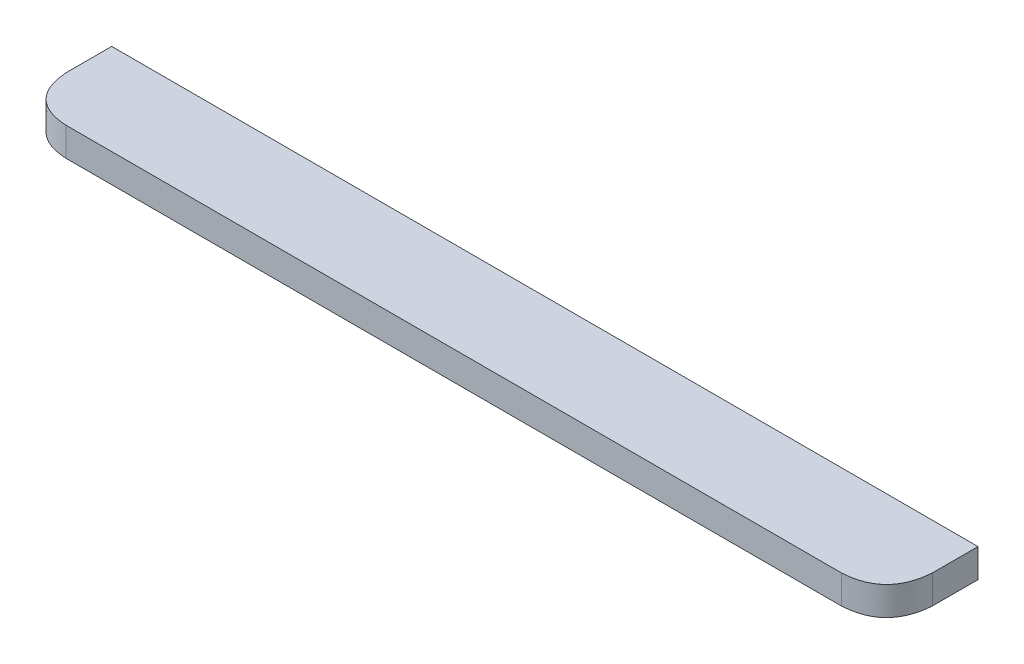
ISO-10303-21;
HEADER;
FILE_DESCRIPTION(('STEP AP214'),'2;1');
FILE_NAME('part.step','',(''),(''),'','','');
FILE_SCHEMA(('AUTOMOTIVE_DESIGN { 1 0 10303 214 1 1 1 1 }'));
ENDSEC;
DATA;
#1=APPLICATION_CONTEXT('core data for automotive mechanical design processes');
#2=APPLICATION_PROTOCOL_DEFINITION('international standard','automotive_design',2000,#1);
#3=PRODUCT_CONTEXT('',#1,'mechanical');
#4=PRODUCT('Part','Part','',(#3));
#5=PRODUCT_RELATED_PRODUCT_CATEGORY('part','',(#4));
#6=PRODUCT_DEFINITION_FORMATION('','',#4);
#7=PRODUCT_DEFINITION_CONTEXT('part definition',#1,'design');
#8=PRODUCT_DEFINITION('design','',#6,#7);
#9=PRODUCT_DEFINITION_SHAPE('','',#8);
#10=(LENGTH_UNIT() NAMED_UNIT(*) SI_UNIT(.MILLI.,.METRE.));
#11=(NAMED_UNIT(*) PLANE_ANGLE_UNIT() SI_UNIT($,.RADIAN.));
#12=(NAMED_UNIT(*) SI_UNIT($,.STERADIAN.) SOLID_ANGLE_UNIT());
#13=UNCERTAINTY_MEASURE_WITH_UNIT(LENGTH_MEASURE(1.E-05),#10,'distance_accuracy_value','');
#14=(GEOMETRIC_REPRESENTATION_CONTEXT(3) GLOBAL_UNCERTAINTY_ASSIGNED_CONTEXT((#13)) GLOBAL_UNIT_ASSIGNED_CONTEXT((#10,
#11,#12)) REPRESENTATION_CONTEXT('',''));
#15=CARTESIAN_POINT('',(0.,0.,0.));
#16=DIRECTION('',(0.,0.,1.));
#17=DIRECTION('',(1.,0.,0.));
#18=AXIS2_PLACEMENT_3D('',#15,#16,#17);
#19=CARTESIAN_POINT('',(120.777,8.,-0.365773185120499));
#20=DIRECTION('',(0.,0.,1.));
#21=DIRECTION('',(1.,0.,0.));
#22=AXIS2_PLACEMENT_3D('',#19,#20,#21);
#23=PLANE('',#22);
#24=DIRECTION('',(-1.,0.,0.));
#25=VECTOR('',#24,1.);
#26=CARTESIAN_POINT('',(120.777,0.,-0.365773185120499));
#27=LINE('',#26,#25);
#28=CARTESIAN_POINT('',(120.777,0.,-0.365773185120499));
#29=VERTEX_POINT('',#28);
#30=CARTESIAN_POINT('',(-120.777,0.,-0.365773185120469));
#31=VERTEX_POINT('',#30);
#32=EDGE_CURVE('E189',#29,#31,#27,.T.);
#33=ORIENTED_EDGE('',*,*,#32,.T.);
#34=DIRECTION('',(0.,-1.,0.));
#35=VECTOR('',#34,1.);
#36=CARTESIAN_POINT('',(-120.777,8.,-0.365773185120469));
#37=LINE('',#36,#35);
#38=CARTESIAN_POINT('',(-120.777,8.,-0.365773185120469));
#39=VERTEX_POINT('',#38);
#40=EDGE_CURVE('E11',#39,#31,#37,.T.);
#41=ORIENTED_EDGE('',*,*,#40,.F.);
#42=DIRECTION('',(-1.,0.,0.));
#43=VECTOR('',#42,1.);
#44=CARTESIAN_POINT('',(120.777,8.,-0.365773185120499));
#45=LINE('',#44,#43);
#46=CARTESIAN_POINT('',(120.777,8.,-0.365773185120499));
#47=VERTEX_POINT('',#46);
#48=EDGE_CURVE('E160',#47,#39,#45,.T.);
#49=ORIENTED_EDGE('',*,*,#48,.F.);
#50=DIRECTION('',(0.,-1.,0.));
#51=VECTOR('',#50,1.);
#52=CARTESIAN_POINT('',(120.777,8.,-0.365773185120499));
#53=LINE('',#52,#51);
#54=EDGE_CURVE('E128',#47,#29,#53,.T.);
#55=ORIENTED_EDGE('',*,*,#54,.T.);
#56=EDGE_LOOP('',(#33,#41,#49,#55));
#57=FACE_BOUND('',#56,.T.);
#58=ADVANCED_FACE('F43',(#57),#23,.F.);
#59=CARTESIAN_POINT('',(-120.777,8.,12.3342268148795));
#60=DIRECTION('',(1.,0.,0.));
#61=DIRECTION('',(0.,0.,-1.));
#62=AXIS2_PLACEMENT_3D('',#59,#60,#61);
#63=PLANE('',#62);
#64=DIRECTION('',(0.,0.,1.));
#65=VECTOR('',#64,1.);
#66=CARTESIAN_POINT('',(-120.777,0.,12.3342268148795));
#67=LINE('',#66,#65);
#68=CARTESIAN_POINT('',(-120.777,0.,12.3342268148795));
#69=VERTEX_POINT('',#68);
#70=EDGE_CURVE('E184',#31,#69,#67,.T.);
#71=ORIENTED_EDGE('',*,*,#70,.T.);
#72=DIRECTION('',(0.,-1.,0.));
#73=VECTOR('',#72,1.);
#74=CARTESIAN_POINT('',(-120.777,8.,12.3342268148795));
#75=LINE('',#74,#73);
#76=CARTESIAN_POINT('',(-120.777,8.,12.3342268148795));
#77=VERTEX_POINT('',#76);
#78=EDGE_CURVE('E52',#77,#69,#75,.T.);
#79=ORIENTED_EDGE('',*,*,#78,.F.);
#80=DIRECTION('',(0.,0.,1.));
#81=VECTOR('',#80,1.);
#82=CARTESIAN_POINT('',(-120.777,8.,12.3342268148795));
#83=LINE('',#82,#81);
#84=EDGE_CURVE('E97',#39,#77,#83,.T.);
#85=ORIENTED_EDGE('',*,*,#84,.F.);
#86=ORIENTED_EDGE('',*,*,#40,.T.);
#87=EDGE_LOOP('',(#71,#79,#85,#86));
#88=FACE_BOUND('',#87,.T.);
#89=ADVANCED_FACE('F148',(#88),#63,.F.);
#90=CARTESIAN_POINT('',(-120.777,8.,12.3342268148795));
#91=CARTESIAN_POINT('',(-119.922774984959,8.,24.4246343458721));
#92=CARTESIAN_POINT('',(-108.077,8.,25.0342268148795));
#93=B_SPLINE_CURVE_WITH_KNOTS('',2,(#90,#91,#92),.UNSPECIFIED.,.F.,.F.,(3,3),(0.,1.),.UNSPECIFIED.);
#94=DIRECTION('',(0.,-1.,0.));
#95=VECTOR('',#94,1.);
#96=SURFACE_OF_LINEAR_EXTRUSION('',#93,#95);
#97=CARTESIAN_POINT('',(-120.777,0.,12.3342268148795));
#98=CARTESIAN_POINT('',(-119.922774984959,0.,24.4246343458721));
#99=CARTESIAN_POINT('',(-108.077,0.,25.0342268148795));
#100=B_SPLINE_CURVE_WITH_KNOTS('',2,(#97,#98,#99),.UNSPECIFIED.,.F.,.F.,(3,3),(0.,1.),.UNSPECIFIED.);
#101=CARTESIAN_POINT('',(-108.077,0.,25.0342268148795));
#102=VERTEX_POINT('',#101);
#103=EDGE_CURVE('E180',#69,#102,#100,.T.);
#104=ORIENTED_EDGE('',*,*,#103,.T.);
#105=DIRECTION('',(0.,-1.,0.));
#106=VECTOR('',#105,1.);
#107=CARTESIAN_POINT('',(-108.077,8.,25.0342268148795));
#108=LINE('',#107,#106);
#109=CARTESIAN_POINT('',(-108.077,8.,25.0342268148795));
#110=VERTEX_POINT('',#109);
#111=EDGE_CURVE('E121',#110,#102,#108,.T.);
#112=ORIENTED_EDGE('',*,*,#111,.F.);
#113=EDGE_CURVE('E110',#77,#110,#93,.T.);
#114=ORIENTED_EDGE('',*,*,#113,.F.);
#115=ORIENTED_EDGE('',*,*,#78,.T.);
#116=EDGE_LOOP('',(#104,#112,#114,#115));
#117=FACE_BOUND('',#116,.T.);
#118=ADVANCED_FACE('F146',(#117),#96,.F.);
#119=CARTESIAN_POINT('',(-108.077,8.,25.0342268148795));
#120=DIRECTION('',(0.,0.,-1.));
#121=DIRECTION('',(-1.,0.,0.));
#122=AXIS2_PLACEMENT_3D('',#119,#120,#121);
#123=PLANE('',#122);
#124=DIRECTION('',(1.,0.,0.));
#125=VECTOR('',#124,1.);
#126=CARTESIAN_POINT('',(-108.077,0.,25.0342268148795));
#127=LINE('',#126,#125);
#128=CARTESIAN_POINT('',(108.077,0.,25.0342268148795));
#129=VERTEX_POINT('',#128);
#130=EDGE_CURVE('E119',#102,#129,#127,.T.);
#131=ORIENTED_EDGE('',*,*,#130,.T.);
#132=DIRECTION('',(0.,-1.,0.));
#133=VECTOR('',#132,1.);
#134=CARTESIAN_POINT('',(108.077,8.,25.0342268148795));
#135=LINE('',#134,#133);
#136=CARTESIAN_POINT('',(108.077,8.,25.0342268148795));
#137=VERTEX_POINT('',#136);
#138=EDGE_CURVE('E116',#137,#129,#135,.T.);
#139=ORIENTED_EDGE('',*,*,#138,.F.);
#140=DIRECTION('',(1.,0.,0.));
#141=VECTOR('',#140,1.);
#142=CARTESIAN_POINT('',(-108.077,8.,25.0342268148795));
#143=LINE('',#142,#141);
#144=EDGE_CURVE('E104',#110,#137,#143,.T.);
#145=ORIENTED_EDGE('',*,*,#144,.F.);
#146=ORIENTED_EDGE('',*,*,#111,.T.);
#147=EDGE_LOOP('',(#131,#139,#145,#146));
#148=FACE_BOUND('',#147,.T.);
#149=ADVANCED_FACE('F117',(#148),#123,.F.);
#150=CARTESIAN_POINT('',(108.077,8.,25.0342268148795));
#151=CARTESIAN_POINT('',(119.922774984959,8.,24.4246343458721));
#152=CARTESIAN_POINT('',(120.777,8.,12.3342268148795));
#153=B_SPLINE_CURVE_WITH_KNOTS('',2,(#150,#151,#152),.UNSPECIFIED.,.F.,.F.,(3,3),(0.,1.),.UNSPECIFIED.);
#154=DIRECTION('',(0.,-1.,0.));
#155=VECTOR('',#154,1.);
#156=SURFACE_OF_LINEAR_EXTRUSION('',#153,#155);
#157=CARTESIAN_POINT('',(108.077,0.,25.0342268148795));
#158=CARTESIAN_POINT('',(119.922774984959,0.,24.4246343458721));
#159=CARTESIAN_POINT('',(120.777,0.,12.3342268148795));
#160=B_SPLINE_CURVE_WITH_KNOTS('',2,(#157,#158,#159),.UNSPECIFIED.,.F.,.F.,(3,3),(0.,1.),.UNSPECIFIED.);
#161=CARTESIAN_POINT('',(120.777,0.,12.3342268148795));
#162=VERTEX_POINT('',#161);
#163=EDGE_CURVE('E83',#129,#162,#160,.T.);
#164=ORIENTED_EDGE('',*,*,#163,.T.);
#165=DIRECTION('',(0.,-1.,0.));
#166=VECTOR('',#165,1.);
#167=CARTESIAN_POINT('',(120.777,8.,12.3342268148795));
#168=LINE('',#167,#166);
#169=CARTESIAN_POINT('',(120.777,8.,12.3342268148795));
#170=VERTEX_POINT('',#169);
#171=EDGE_CURVE('E122',#170,#162,#168,.T.);
#172=ORIENTED_EDGE('',*,*,#171,.F.);
#173=EDGE_CURVE('E108',#137,#170,#153,.T.);
#174=ORIENTED_EDGE('',*,*,#173,.F.);
#175=ORIENTED_EDGE('',*,*,#138,.T.);
#176=EDGE_LOOP('',(#164,#172,#174,#175));
#177=FACE_BOUND('',#176,.T.);
#178=ADVANCED_FACE('F124',(#177),#156,.F.);
#179=CARTESIAN_POINT('',(120.777,8.,12.3342268148795));
#180=DIRECTION('',(-1.,0.,0.));
#181=DIRECTION('',(0.,0.,1.));
#182=AXIS2_PLACEMENT_3D('',#179,#180,#181);
#183=PLANE('',#182);
#184=DIRECTION('',(0.,0.,-1.));
#185=VECTOR('',#184,1.);
#186=CARTESIAN_POINT('',(120.777,0.,12.3342268148795));
#187=LINE('',#186,#185);
#188=EDGE_CURVE('E89',#162,#29,#187,.T.);
#189=ORIENTED_EDGE('',*,*,#188,.T.);
#190=ORIENTED_EDGE('',*,*,#54,.F.);
#191=DIRECTION('',(0.,0.,-1.));
#192=VECTOR('',#191,1.);
#193=CARTESIAN_POINT('',(120.777,8.,12.3342268148795));
#194=LINE('',#193,#192);
#195=EDGE_CURVE('E60',#170,#47,#194,.T.);
#196=ORIENTED_EDGE('',*,*,#195,.F.);
#197=ORIENTED_EDGE('',*,*,#171,.T.);
#198=EDGE_LOOP('',(#189,#190,#196,#197));
#199=FACE_BOUND('',#198,.T.);
#200=ADVANCED_FACE('F142',(#199),#183,.F.);
#201=CARTESIAN_POINT('',(-117.17488749248,8.,21.5544305803758));
#202=DIRECTION('',(0.,1.,0.));
#203=DIRECTION('',(0.,0.,1.));
#204=AXIS2_PLACEMENT_3D('',#201,#202,#203);
#205=PLANE('',#204);
#206=ORIENTED_EDGE('',*,*,#48,.T.);
#207=ORIENTED_EDGE('',*,*,#84,.T.);
#208=ORIENTED_EDGE('',*,*,#113,.T.);
#209=ORIENTED_EDGE('',*,*,#144,.T.);
#210=ORIENTED_EDGE('',*,*,#173,.T.);
#211=ORIENTED_EDGE('',*,*,#195,.T.);
#212=EDGE_LOOP('',(#206,#207,#208,#209,#210,#211));
#213=FACE_BOUND('',#212,.T.);
#214=ADVANCED_FACE('F106',(#213),#205,.T.);
#215=CARTESIAN_POINT('',(-117.17488749248,0.,21.5544305803758));
#216=DIRECTION('',(0.,1.,0.));
#217=DIRECTION('',(0.,0.,1.));
#218=AXIS2_PLACEMENT_3D('',#215,#216,#217);
#219=PLANE('',#218);
#220=ORIENTED_EDGE('',*,*,#32,.F.);
#221=ORIENTED_EDGE('',*,*,#188,.F.);
#222=ORIENTED_EDGE('',*,*,#163,.F.);
#223=ORIENTED_EDGE('',*,*,#130,.F.);
#224=ORIENTED_EDGE('',*,*,#103,.F.);
#225=ORIENTED_EDGE('',*,*,#70,.F.);
#226=EDGE_LOOP('',(#220,#221,#222,#223,#224,#225));
#227=FACE_BOUND('',#226,.T.);
#228=ADVANCED_FACE('F183',(#227),#219,.F.);
#229=CLOSED_SHELL('',(#58,#89,#118,#149,#178,#200,#214,#228));
#230=MANIFOLD_SOLID_BREP('B2',#229);
#231=ADVANCED_BREP_SHAPE_REPRESENTATION('',(#18,#230),#14);
#232=SHAPE_DEFINITION_REPRESENTATION(#9,#231);
ENDSEC;
END-ISO-10303-21;
